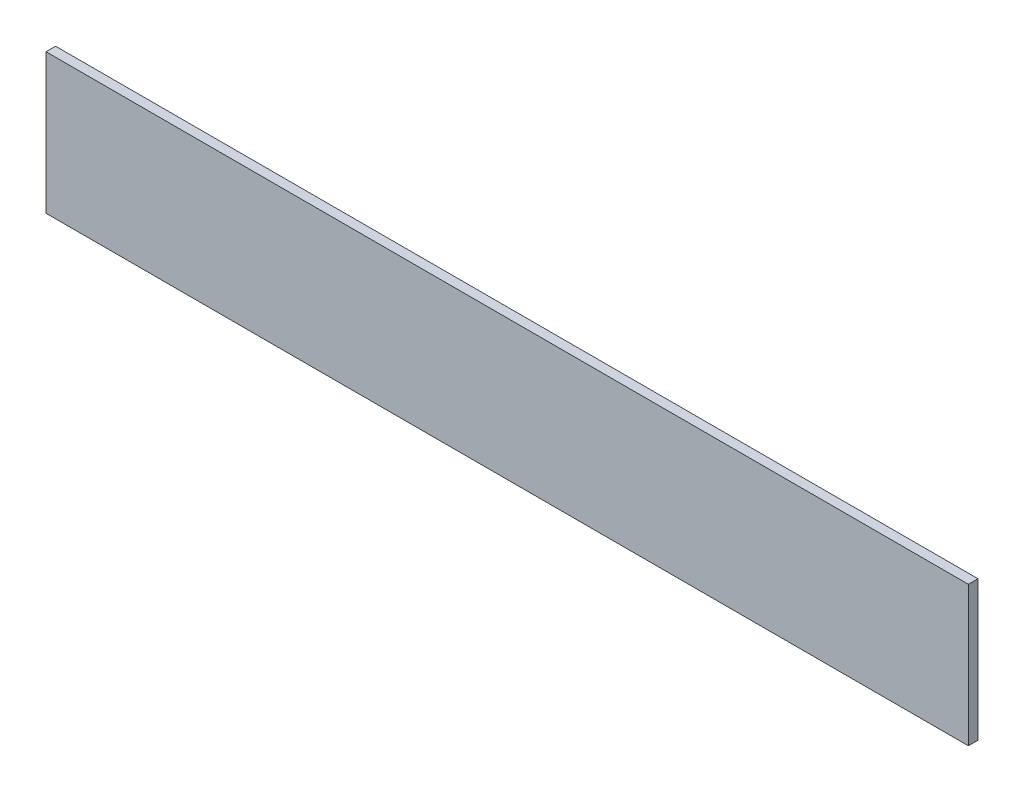
ISO-10303-21;
HEADER;
FILE_DESCRIPTION(('STEP AP214'),'2;1');
FILE_NAME('part.step','',(''),(''),'','','');
FILE_SCHEMA(('AUTOMOTIVE_DESIGN { 1 0 10303 214 1 1 1 1 }'));
ENDSEC;
DATA;
#1=APPLICATION_CONTEXT('core data for automotive mechanical design processes');
#2=APPLICATION_PROTOCOL_DEFINITION('international standard','automotive_design',2000,#1);
#3=PRODUCT_CONTEXT('',#1,'mechanical');
#4=PRODUCT('Part','Part','',(#3));
#5=PRODUCT_RELATED_PRODUCT_CATEGORY('part','',(#4));
#6=PRODUCT_DEFINITION_FORMATION('','',#4);
#7=PRODUCT_DEFINITION_CONTEXT('part definition',#1,'design');
#8=PRODUCT_DEFINITION('design','',#6,#7);
#9=PRODUCT_DEFINITION_SHAPE('','',#8);
#10=(LENGTH_UNIT() NAMED_UNIT(*) SI_UNIT(.MILLI.,.METRE.));
#11=(NAMED_UNIT(*) PLANE_ANGLE_UNIT() SI_UNIT($,.RADIAN.));
#12=(NAMED_UNIT(*) SI_UNIT($,.STERADIAN.) SOLID_ANGLE_UNIT());
#13=UNCERTAINTY_MEASURE_WITH_UNIT(LENGTH_MEASURE(1.E-05),#10,'distance_accuracy_value','');
#14=(GEOMETRIC_REPRESENTATION_CONTEXT(3) GLOBAL_UNCERTAINTY_ASSIGNED_CONTEXT((#13)) GLOBAL_UNIT_ASSIGNED_CONTEXT((#10,
#11,#12)) REPRESENTATION_CONTEXT('',''));
#15=CARTESIAN_POINT('',(0.,0.,0.));
#16=DIRECTION('',(0.,0.,1.));
#17=DIRECTION('',(1.,0.,0.));
#18=AXIS2_PLACEMENT_3D('',#15,#16,#17);
#19=CARTESIAN_POINT('',(609.6,-92.456,12.7));
#20=DIRECTION('',(-1.,0.,0.));
#21=DIRECTION('',(0.,0.,1.));
#22=AXIS2_PLACEMENT_3D('',#19,#20,#21);
#23=PLANE('',#22);
#24=DIRECTION('',(0.,1.,0.));
#25=VECTOR('',#24,1.);
#26=CARTESIAN_POINT('',(609.6,-92.456,0.));
#27=LINE('',#26,#25);
#28=CARTESIAN_POINT('',(609.6,-92.456,0.));
#29=VERTEX_POINT('',#28);
#30=CARTESIAN_POINT('',(609.6,92.456,0.));
#31=VERTEX_POINT('',#30);
#32=EDGE_CURVE('E102',#29,#31,#27,.T.);
#33=ORIENTED_EDGE('',*,*,#32,.T.);
#34=DIRECTION('',(0.,0.,-1.));
#35=VECTOR('',#34,1.);
#36=CARTESIAN_POINT('',(609.6,92.456,12.7));
#37=LINE('',#36,#35);
#38=CARTESIAN_POINT('',(609.6,92.456,12.7));
#39=VERTEX_POINT('',#38);
#40=EDGE_CURVE('E11',#39,#31,#37,.T.);
#41=ORIENTED_EDGE('',*,*,#40,.F.);
#42=DIRECTION('',(0.,1.,0.));
#43=VECTOR('',#42,1.);
#44=CARTESIAN_POINT('',(609.6,-92.456,12.7));
#45=LINE('',#44,#43);
#46=CARTESIAN_POINT('',(609.6,-92.456,12.7));
#47=VERTEX_POINT('',#46);
#48=EDGE_CURVE('E90',#47,#39,#45,.T.);
#49=ORIENTED_EDGE('',*,*,#48,.F.);
#50=DIRECTION('',(0.,0.,-1.));
#51=VECTOR('',#50,1.);
#52=CARTESIAN_POINT('',(609.6,-92.456,12.7));
#53=LINE('',#52,#51);
#54=EDGE_CURVE('E98',#47,#29,#53,.T.);
#55=ORIENTED_EDGE('',*,*,#54,.T.);
#56=EDGE_LOOP('',(#33,#41,#49,#55));
#57=FACE_BOUND('',#56,.T.);
#58=ADVANCED_FACE('F39',(#57),#23,.F.);
#59=CARTESIAN_POINT('',(-609.6,92.456,12.7));
#60=DIRECTION('',(0.,-1.,0.));
#61=DIRECTION('',(0.,0.,-1.));
#62=AXIS2_PLACEMENT_3D('',#59,#60,#61);
#63=PLANE('',#62);
#64=DIRECTION('',(-1.,0.,0.));
#65=VECTOR('',#64,1.);
#66=CARTESIAN_POINT('',(-609.6,92.456,0.));
#67=LINE('',#66,#65);
#68=CARTESIAN_POINT('',(-609.6,92.456,0.));
#69=VERTEX_POINT('',#68);
#70=EDGE_CURVE('E94',#31,#69,#67,.T.);
#71=ORIENTED_EDGE('',*,*,#70,.T.);
#72=DIRECTION('',(0.,0.,-1.));
#73=VECTOR('',#72,1.);
#74=CARTESIAN_POINT('',(-609.6,92.456,12.7));
#75=LINE('',#74,#73);
#76=CARTESIAN_POINT('',(-609.6,92.456,12.7));
#77=VERTEX_POINT('',#76);
#78=EDGE_CURVE('E47',#77,#69,#75,.T.);
#79=ORIENTED_EDGE('',*,*,#78,.F.);
#80=DIRECTION('',(-1.,0.,0.));
#81=VECTOR('',#80,1.);
#82=CARTESIAN_POINT('',(-609.6,92.456,12.7));
#83=LINE('',#82,#81);
#84=EDGE_CURVE('E85',#39,#77,#83,.T.);
#85=ORIENTED_EDGE('',*,*,#84,.F.);
#86=ORIENTED_EDGE('',*,*,#40,.T.);
#87=EDGE_LOOP('',(#71,#79,#85,#86));
#88=FACE_BOUND('',#87,.T.);
#89=ADVANCED_FACE('F93',(#88),#63,.F.);
#90=CARTESIAN_POINT('',(-609.6,-92.456,12.7));
#91=DIRECTION('',(1.,0.,0.));
#92=DIRECTION('',(0.,0.,-1.));
#93=AXIS2_PLACEMENT_3D('',#90,#91,#92);
#94=PLANE('',#93);
#95=DIRECTION('',(0.,-1.,0.));
#96=VECTOR('',#95,1.);
#97=CARTESIAN_POINT('',(-609.6,-92.456,0.));
#98=LINE('',#97,#96);
#99=CARTESIAN_POINT('',(-609.6,-92.456,0.));
#100=VERTEX_POINT('',#99);
#101=EDGE_CURVE('E72',#69,#100,#98,.T.);
#102=ORIENTED_EDGE('',*,*,#101,.T.);
#103=DIRECTION('',(0.,0.,-1.));
#104=VECTOR('',#103,1.);
#105=CARTESIAN_POINT('',(-609.6,-92.456,12.7));
#106=LINE('',#105,#104);
#107=CARTESIAN_POINT('',(-609.6,-92.456,12.7));
#108=VERTEX_POINT('',#107);
#109=EDGE_CURVE('E95',#108,#100,#106,.T.);
#110=ORIENTED_EDGE('',*,*,#109,.F.);
#111=DIRECTION('',(0.,-1.,0.));
#112=VECTOR('',#111,1.);
#113=CARTESIAN_POINT('',(-609.6,-92.456,12.7));
#114=LINE('',#113,#112);
#115=EDGE_CURVE('E88',#77,#108,#114,.T.);
#116=ORIENTED_EDGE('',*,*,#115,.F.);
#117=ORIENTED_EDGE('',*,*,#78,.T.);
#118=EDGE_LOOP('',(#102,#110,#116,#117));
#119=FACE_BOUND('',#118,.T.);
#120=ADVANCED_FACE('F96',(#119),#94,.F.);
#121=CARTESIAN_POINT('',(-609.6,-92.456,12.7));
#122=DIRECTION('',(0.,1.,0.));
#123=DIRECTION('',(0.,0.,1.));
#124=AXIS2_PLACEMENT_3D('',#121,#122,#123);
#125=PLANE('',#124);
#126=DIRECTION('',(1.,0.,0.));
#127=VECTOR('',#126,1.);
#128=CARTESIAN_POINT('',(-609.6,-92.456,0.));
#129=LINE('',#128,#127);
#130=EDGE_CURVE('E78',#100,#29,#129,.T.);
#131=ORIENTED_EDGE('',*,*,#130,.T.);
#132=ORIENTED_EDGE('',*,*,#54,.F.);
#133=DIRECTION('',(1.,0.,0.));
#134=VECTOR('',#133,1.);
#135=CARTESIAN_POINT('',(-609.6,-92.456,12.7));
#136=LINE('',#135,#134);
#137=EDGE_CURVE('E55',#108,#47,#136,.T.);
#138=ORIENTED_EDGE('',*,*,#137,.F.);
#139=ORIENTED_EDGE('',*,*,#109,.T.);
#140=EDGE_LOOP('',(#131,#132,#138,#139));
#141=FACE_BOUND('',#140,.T.);
#142=ADVANCED_FACE('F109',(#141),#125,.F.);
#143=CARTESIAN_POINT('',(0.,0.,12.7));
#144=DIRECTION('',(0.,0.,-1.));
#145=DIRECTION('',(-1.,0.,0.));
#146=AXIS2_PLACEMENT_3D('',#143,#144,#145);
#147=PLANE('',#146);
#148=ORIENTED_EDGE('',*,*,#48,.T.);
#149=ORIENTED_EDGE('',*,*,#84,.T.);
#150=ORIENTED_EDGE('',*,*,#115,.T.);
#151=ORIENTED_EDGE('',*,*,#137,.T.);
#152=EDGE_LOOP('',(#148,#149,#150,#151));
#153=FACE_BOUND('',#152,.T.);
#154=ADVANCED_FACE('F86',(#153),#147,.F.);
#155=CARTESIAN_POINT('',(0.,0.,0.));
#156=DIRECTION('',(0.,0.,-1.));
#157=DIRECTION('',(-1.,0.,0.));
#158=AXIS2_PLACEMENT_3D('',#155,#156,#157);
#159=PLANE('',#158);
#160=ORIENTED_EDGE('',*,*,#32,.F.);
#161=ORIENTED_EDGE('',*,*,#130,.F.);
#162=ORIENTED_EDGE('',*,*,#101,.F.);
#163=ORIENTED_EDGE('',*,*,#70,.F.);
#164=EDGE_LOOP('',(#160,#161,#162,#163));
#165=FACE_BOUND('',#164,.T.);
#166=ADVANCED_FACE('F112',(#165),#159,.T.);
#167=CLOSED_SHELL('',(#58,#89,#120,#142,#154,#166));
#168=MANIFOLD_SOLID_BREP('B2',#167);
#169=ADVANCED_BREP_SHAPE_REPRESENTATION('',(#18,#168),#14);
#170=SHAPE_DEFINITION_REPRESENTATION(#9,#169);
ENDSEC;
END-ISO-10303-21;
